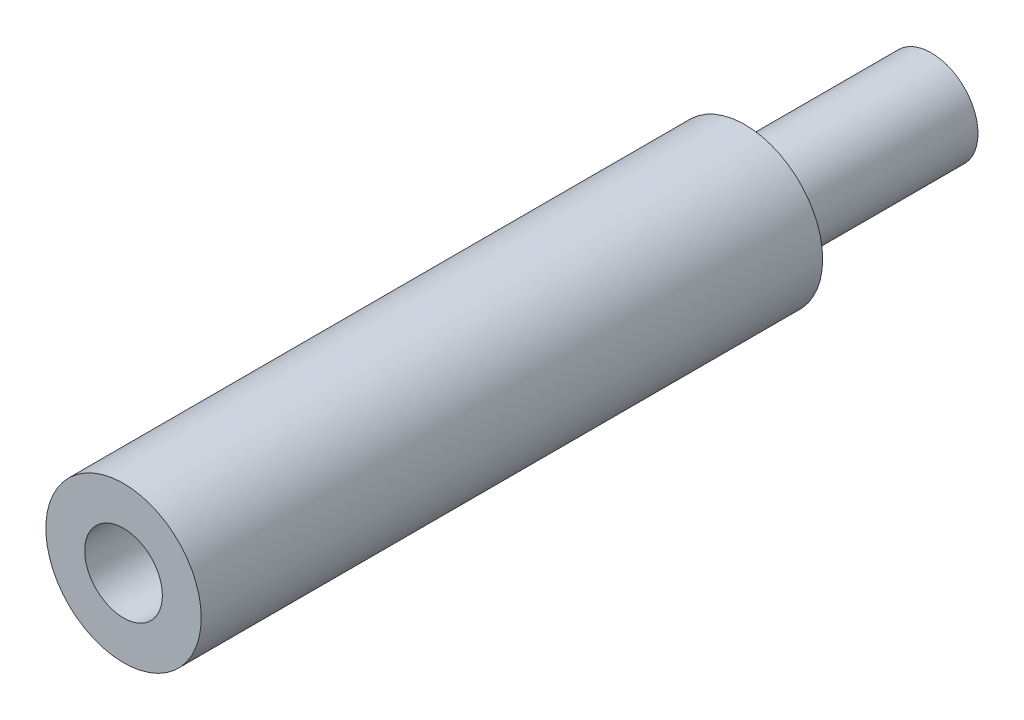
ISO-10303-21;
HEADER;
FILE_DESCRIPTION(('STEP AP214'),'2;1');
FILE_NAME('part.step','',(''),(''),'','','');
FILE_SCHEMA(('AUTOMOTIVE_DESIGN { 1 0 10303 214 1 1 1 1 }'));
ENDSEC;
DATA;
#1=APPLICATION_CONTEXT('core data for automotive mechanical design processes');
#2=APPLICATION_PROTOCOL_DEFINITION('international standard','automotive_design',2000,#1);
#3=PRODUCT_CONTEXT('',#1,'mechanical');
#4=PRODUCT('Part','Part','',(#3));
#5=PRODUCT_RELATED_PRODUCT_CATEGORY('part','',(#4));
#6=PRODUCT_DEFINITION_FORMATION('','',#4);
#7=PRODUCT_DEFINITION_CONTEXT('part definition',#1,'design');
#8=PRODUCT_DEFINITION('design','',#6,#7);
#9=PRODUCT_DEFINITION_SHAPE('','',#8);
#10=(LENGTH_UNIT() NAMED_UNIT(*) SI_UNIT(.MILLI.,.METRE.));
#11=(NAMED_UNIT(*) PLANE_ANGLE_UNIT() SI_UNIT($,.RADIAN.));
#12=(NAMED_UNIT(*) SI_UNIT($,.STERADIAN.) SOLID_ANGLE_UNIT());
#13=UNCERTAINTY_MEASURE_WITH_UNIT(LENGTH_MEASURE(1.E-05),#10,'distance_accuracy_value','');
#14=(GEOMETRIC_REPRESENTATION_CONTEXT(3) GLOBAL_UNCERTAINTY_ASSIGNED_CONTEXT((#13)) GLOBAL_UNIT_ASSIGNED_CONTEXT((#10,
#11,#12)) REPRESENTATION_CONTEXT('',''));
#15=CARTESIAN_POINT('',(0.,0.,0.));
#16=DIRECTION('',(0.,0.,1.));
#17=DIRECTION('',(1.,0.,0.));
#18=AXIS2_PLACEMENT_3D('',#15,#16,#17);
#19=CARTESIAN_POINT('',(0.,0.,6.));
#20=DIRECTION('',(0.,0.,-1.));
#21=DIRECTION('',(-1.,0.,0.));
#22=AXIS2_PLACEMENT_3D('',#19,#20,#21);
#23=CYLINDRICAL_SURFACE('',#22,1.5);
#24=CARTESIAN_POINT('',(0.,0.,6.));
#25=DIRECTION('',(0.,0.,1.));
#26=DIRECTION('',(1.,0.,0.));
#27=AXIS2_PLACEMENT_3D('',#24,#25,#26);
#28=CIRCLE('',#27,1.5);
#29=CARTESIAN_POINT('',(1.5,0.,6.));
#30=VERTEX_POINT('',#29);
#31=EDGE_CURVE('E10',#30,#30,#28,.T.);
#32=ORIENTED_EDGE('',*,*,#31,.F.);
#33=EDGE_LOOP('',(#32));
#34=FACE_BOUND('',#33,.T.);
#35=CARTESIAN_POINT('',(0.,0.,0.));
#36=DIRECTION('',(0.,0.,1.));
#37=DIRECTION('',(1.,0.,0.));
#38=AXIS2_PLACEMENT_3D('',#35,#36,#37);
#39=CIRCLE('',#38,1.5);
#40=CARTESIAN_POINT('',(1.5,0.,0.));
#41=VERTEX_POINT('',#40);
#42=EDGE_CURVE('E42',#41,#41,#39,.T.);
#43=ORIENTED_EDGE('',*,*,#42,.T.);
#44=EDGE_LOOP('',(#43));
#45=FACE_BOUND('',#44,.T.);
#46=ADVANCED_FACE('F39',(#34,#45),#23,.T.);
#47=CARTESIAN_POINT('',(0.,0.,0.));
#48=DIRECTION('',(0.,0.,1.));
#49=DIRECTION('',(1.,0.,0.));
#50=AXIS2_PLACEMENT_3D('',#47,#48,#49);
#51=PLANE('',#50);
#52=ORIENTED_EDGE('',*,*,#42,.F.);
#53=EDGE_LOOP('',(#52));
#54=FACE_BOUND('',#53,.T.);
#55=ADVANCED_FACE('F87',(#54),#51,.F.);
#56=CARTESIAN_POINT('',(0.,0.,26.));
#57=DIRECTION('',(0.,0.,-1.));
#58=DIRECTION('',(-1.,0.,0.));
#59=AXIS2_PLACEMENT_3D('',#56,#57,#58);
#60=CYLINDRICAL_SURFACE('',#59,2.5);
#61=CARTESIAN_POINT('',(0.,0.,26.));
#62=DIRECTION('',(0.,0.,1.));
#63=DIRECTION('',(1.,0.,0.));
#64=AXIS2_PLACEMENT_3D('',#61,#62,#63);
#65=CIRCLE('',#64,2.5);
#66=CARTESIAN_POINT('',(2.5,0.,26.));
#67=VERTEX_POINT('',#66);
#68=EDGE_CURVE('E51',#67,#67,#65,.T.);
#69=ORIENTED_EDGE('',*,*,#68,.F.);
#70=EDGE_LOOP('',(#69));
#71=FACE_BOUND('',#70,.T.);
#72=CARTESIAN_POINT('',(0.,0.,6.));
#73=DIRECTION('',(0.,0.,1.));
#74=DIRECTION('',(1.,0.,0.));
#75=AXIS2_PLACEMENT_3D('',#72,#73,#74);
#76=CIRCLE('',#75,2.5);
#77=CARTESIAN_POINT('',(2.5,0.,6.));
#78=VERTEX_POINT('',#77);
#79=EDGE_CURVE('E53',#78,#78,#76,.T.);
#80=ORIENTED_EDGE('',*,*,#79,.T.);
#81=EDGE_LOOP('',(#80));
#82=FACE_BOUND('',#81,.T.);
#83=ADVANCED_FACE('F81',(#71,#82),#60,.T.);
#84=CARTESIAN_POINT('',(0.,0.,26.));
#85=DIRECTION('',(0.,0.,1.));
#86=DIRECTION('',(1.,0.,0.));
#87=AXIS2_PLACEMENT_3D('',#84,#85,#86);
#88=PLANE('',#87);
#89=CARTESIAN_POINT('',(0.,0.,26.));
#90=DIRECTION('',(0.,0.,1.));
#91=DIRECTION('',(1.,0.,0.));
#92=AXIS2_PLACEMENT_3D('',#89,#90,#91);
#93=CIRCLE('',#92,1.25);
#94=CARTESIAN_POINT('',(1.25,0.,26.));
#95=VERTEX_POINT('',#94);
#96=EDGE_CURVE('E61',#95,#95,#93,.T.);
#97=ORIENTED_EDGE('',*,*,#96,.F.);
#98=EDGE_LOOP('',(#97));
#99=FACE_BOUND('',#98,.T.);
#100=ORIENTED_EDGE('',*,*,#68,.T.);
#101=EDGE_LOOP('',(#100));
#102=FACE_BOUND('',#101,.T.);
#103=ADVANCED_FACE('F78',(#99,#102),#88,.T.);
#104=CARTESIAN_POINT('',(0.,0.,6.));
#105=DIRECTION('',(0.,0.,1.));
#106=DIRECTION('',(1.,0.,0.));
#107=AXIS2_PLACEMENT_3D('',#104,#105,#106);
#108=PLANE('',#107);
#109=ORIENTED_EDGE('',*,*,#31,.T.);
#110=EDGE_LOOP('',(#109));
#111=FACE_BOUND('',#110,.T.);
#112=ORIENTED_EDGE('',*,*,#79,.F.);
#113=EDGE_LOOP('',(#112));
#114=FACE_BOUND('',#113,.T.);
#115=ADVANCED_FACE('F74',(#111,#114),#108,.F.);
#116=CARTESIAN_POINT('',(0.,0.,20.));
#117=DIRECTION('',(0.,0.,1.));
#118=DIRECTION('',(1.,0.,0.));
#119=AXIS2_PLACEMENT_3D('',#116,#117,#118);
#120=CYLINDRICAL_SURFACE('',#119,1.25);
#121=CARTESIAN_POINT('',(0.,0.,20.));
#122=DIRECTION('',(0.,0.,1.));
#123=DIRECTION('',(1.,0.,0.));
#124=AXIS2_PLACEMENT_3D('',#121,#122,#123);
#125=CIRCLE('',#124,1.25);
#126=CARTESIAN_POINT('',(1.25,0.,20.));
#127=VERTEX_POINT('',#126);
#128=EDGE_CURVE('E57',#127,#127,#125,.T.);
#129=ORIENTED_EDGE('',*,*,#128,.F.);
#130=EDGE_LOOP('',(#129));
#131=FACE_BOUND('',#130,.T.);
#132=ORIENTED_EDGE('',*,*,#96,.T.);
#133=EDGE_LOOP('',(#132));
#134=FACE_BOUND('',#133,.T.);
#135=ADVANCED_FACE('F71',(#131,#134),#120,.F.);
#136=CARTESIAN_POINT('',(0.,0.,20.));
#137=DIRECTION('',(0.,0.,1.));
#138=DIRECTION('',(1.,0.,0.));
#139=AXIS2_PLACEMENT_3D('',#136,#137,#138);
#140=PLANE('',#139);
#141=ORIENTED_EDGE('',*,*,#128,.T.);
#142=EDGE_LOOP('',(#141));
#143=FACE_BOUND('',#142,.T.);
#144=ADVANCED_FACE('F69',(#143),#140,.T.);
#145=CLOSED_SHELL('',(#46,#55,#83,#103,#115,#135,#144));
#146=MANIFOLD_SOLID_BREP('B2',#145);
#147=ADVANCED_BREP_SHAPE_REPRESENTATION('',(#18,#146),#14);
#148=SHAPE_DEFINITION_REPRESENTATION(#9,#147);
ENDSEC;
END-ISO-10303-21;
